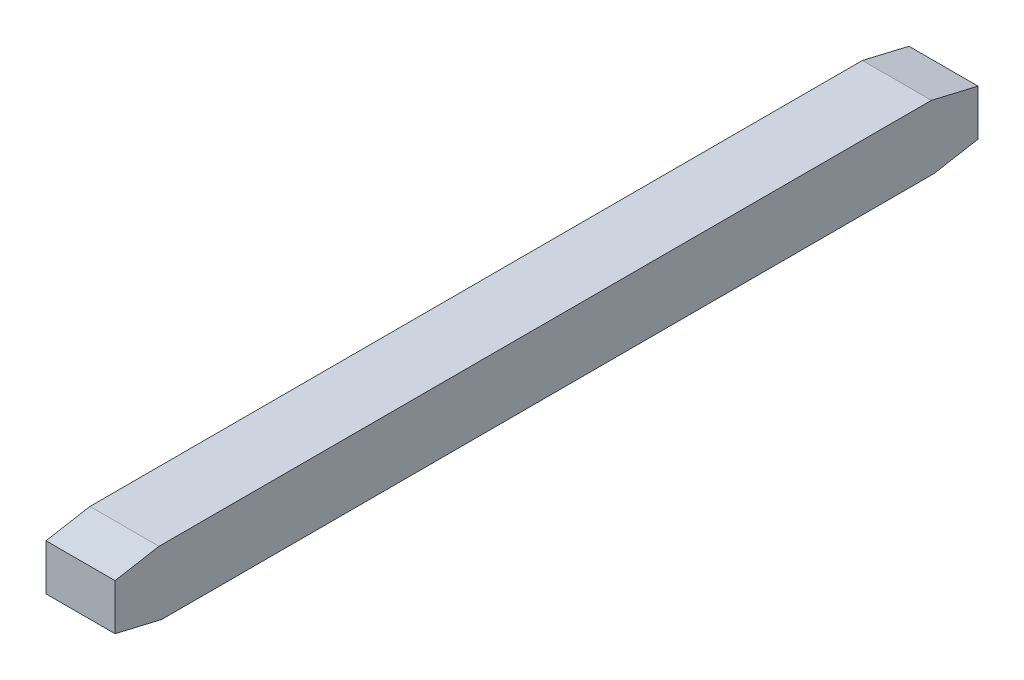
ISO-10303-21;
HEADER;
FILE_DESCRIPTION(('STEP AP214'),'2;1');
FILE_NAME('part.step','',(''),(''),'','','');
FILE_SCHEMA(('AUTOMOTIVE_DESIGN { 1 0 10303 214 1 1 1 1 }'));
ENDSEC;
DATA;
#1=APPLICATION_CONTEXT('core data for automotive mechanical design processes');
#2=APPLICATION_PROTOCOL_DEFINITION('international standard','automotive_design',2000,#1);
#3=PRODUCT_CONTEXT('',#1,'mechanical');
#4=PRODUCT('Part','Part','',(#3));
#5=PRODUCT_RELATED_PRODUCT_CATEGORY('part','',(#4));
#6=PRODUCT_DEFINITION_FORMATION('','',#4);
#7=PRODUCT_DEFINITION_CONTEXT('part definition',#1,'design');
#8=PRODUCT_DEFINITION('design','',#6,#7);
#9=PRODUCT_DEFINITION_SHAPE('','',#8);
#10=(LENGTH_UNIT() NAMED_UNIT(*) SI_UNIT(.MILLI.,.METRE.));
#11=(NAMED_UNIT(*) PLANE_ANGLE_UNIT() SI_UNIT($,.RADIAN.));
#12=(NAMED_UNIT(*) SI_UNIT($,.STERADIAN.) SOLID_ANGLE_UNIT());
#13=UNCERTAINTY_MEASURE_WITH_UNIT(LENGTH_MEASURE(1.E-05),#10,'distance_accuracy_value','');
#14=(GEOMETRIC_REPRESENTATION_CONTEXT(3) GLOBAL_UNCERTAINTY_ASSIGNED_CONTEXT((#13)) GLOBAL_UNIT_ASSIGNED_CONTEXT((#10,
#11,#12)) REPRESENTATION_CONTEXT('',''));
#15=CARTESIAN_POINT('',(0.,0.,0.));
#16=DIRECTION('',(0.,0.,1.));
#17=DIRECTION('',(1.,0.,0.));
#18=AXIS2_PLACEMENT_3D('',#15,#16,#17);
#19=CARTESIAN_POINT('',(6.037607448466,1.714899909266,-5.767942124888));
#20=DIRECTION('',(0.,0.973414507556865,-0.229050641731968));
#21=DIRECTION('',(-1.,0.,0.));
#22=AXIS2_PLACEMENT_3D('',#19,#20,#21);
#23=PLANE('',#22);
#24=DIRECTION('',(0.,0.229050641731968,0.973414507556865));
#25=VECTOR('',#24,1.);
#26=CARTESIAN_POINT('',(6.020000448466,3.155448876961,0.354072));
#27=LINE('',#26,#25);
#28=CARTESIAN_POINT('',(6.020000448466,1.613233935736,-6.2));
#29=VERTEX_POINT('',#28);
#30=CARTESIAN_POINT('',(6.020000448466,1.714899909266,-5.767942124888));
#31=VERTEX_POINT('',#30);
#32=EDGE_CURVE('E147',#29,#31,#27,.T.);
#33=ORIENTED_EDGE('',*,*,#32,.T.);
#34=DIRECTION('',(1.,0.,0.));
#35=VECTOR('',#34,1.);
#36=CARTESIAN_POINT('',(6.324893162748,1.714899909266,-5.767942124888));
#37=LINE('',#36,#35);
#38=CARTESIAN_POINT('',(6.660000162743,1.714899909266,-5.767942124888));
#39=VERTEX_POINT('',#38);
#40=EDGE_CURVE('E160',#31,#39,#37,.T.);
#41=ORIENTED_EDGE('',*,*,#40,.T.);
#42=DIRECTION('',(0.,-0.229050641731968,-0.973414507556865));
#43=VECTOR('',#42,1.);
#44=CARTESIAN_POINT('',(6.660000162743,3.155448876961,0.354072));
#45=LINE('',#44,#43);
#46=CARTESIAN_POINT('',(6.660000162743,1.613233935736,-6.2));
#47=VERTEX_POINT('',#46);
#48=EDGE_CURVE('E167',#39,#47,#45,.T.);
#49=ORIENTED_EDGE('',*,*,#48,.T.);
#50=DIRECTION('',(-1.,0.,0.));
#51=VECTOR('',#50,1.);
#52=CARTESIAN_POINT('',(6.324893162748,1.613233935736,-6.2));
#53=LINE('',#52,#51);
#54=EDGE_CURVE('E11',#47,#29,#53,.T.);
#55=ORIENTED_EDGE('',*,*,#54,.T.);
#56=EDGE_LOOP('',(#33,#41,#49,#55));
#57=FACE_BOUND('',#56,.T.);
#58=ADVANCED_FACE('F17',(#57),#23,.T.);
#59=CARTESIAN_POINT('',(6.324893162748,2.203471337813,-6.2));
#60=DIRECTION('',(0.,0.,1.));
#61=DIRECTION('',(1.,0.,0.));
#62=AXIS2_PLACEMENT_3D('',#59,#60,#61);
#63=PLANE('',#62);
#64=ORIENTED_EDGE('',*,*,#54,.F.);
#65=DIRECTION('',(0.,-1.,0.));
#66=VECTOR('',#65,1.);
#67=CARTESIAN_POINT('',(6.660000162743,-26.47327866179,-6.2));
#68=LINE('',#67,#66);
#69=CARTESIAN_POINT('',(6.660000162743,1.186765593588,-6.2));
#70=VERTEX_POINT('',#69);
#71=EDGE_CURVE('E164',#47,#70,#68,.T.);
#72=ORIENTED_EDGE('',*,*,#71,.T.);
#73=DIRECTION('',(1.,0.,0.));
#74=VECTOR('',#73,1.);
#75=CARTESIAN_POINT('',(6.324893162748,1.186765593588,-6.2));
#76=LINE('',#75,#74);
#77=CARTESIAN_POINT('',(6.020000448466,1.186765593588,-6.2));
#78=VERTEX_POINT('',#77);
#79=EDGE_CURVE('E27',#78,#70,#76,.T.);
#80=ORIENTED_EDGE('',*,*,#79,.F.);
#81=DIRECTION('',(0.,1.,0.));
#82=VECTOR('',#81,1.);
#83=CARTESIAN_POINT('',(6.020000448466,-26.47327866179,-6.2));
#84=LINE('',#83,#82);
#85=EDGE_CURVE('E150',#78,#29,#84,.T.);
#86=ORIENTED_EDGE('',*,*,#85,.T.);
#87=EDGE_LOOP('',(#64,#72,#80,#86));
#88=FACE_BOUND('',#87,.T.);
#89=ADVANCED_FACE('F211',(#88),#63,.F.);
#90=CARTESIAN_POINT('',(6.037607448466,1.186765593588,-6.2));
#91=DIRECTION('',(0.,-0.984784936297443,-0.173777528011078));
#92=DIRECTION('',(0.,0.173777528011078,-0.984784936297443));
#93=AXIS2_PLACEMENT_3D('',#90,#91,#92);
#94=PLANE('',#93);
#95=DIRECTION('',(0.,0.173777528011078,-0.984784936297443));
#96=VECTOR('',#95,1.);
#97=CARTESIAN_POINT('',(6.020000448466,0.03021822107169,0.354072));
#98=LINE('',#97,#96);
#99=CARTESIAN_POINT('',(6.020000448466,1.114899909275,-5.792742259841));
#100=VERTEX_POINT('',#99);
#101=EDGE_CURVE('E170',#100,#78,#98,.T.);
#102=ORIENTED_EDGE('',*,*,#101,.T.);
#103=ORIENTED_EDGE('',*,*,#79,.T.);
#104=DIRECTION('',(0.,-0.173777528011078,0.984784936297443));
#105=VECTOR('',#104,1.);
#106=CARTESIAN_POINT('',(6.660000162743,0.03021822107169,0.354072));
#107=LINE('',#106,#105);
#108=CARTESIAN_POINT('',(6.660000162743,1.114899909275,-5.792742259841));
#109=VERTEX_POINT('',#108);
#110=EDGE_CURVE('E158',#70,#109,#107,.T.);
#111=ORIENTED_EDGE('',*,*,#110,.T.);
#112=DIRECTION('',(-1.,0.,0.));
#113=VECTOR('',#112,1.);
#114=CARTESIAN_POINT('',(6.324893162748,1.114899909275,-5.792742259841));
#115=LINE('',#114,#113);
#116=EDGE_CURVE('E145',#109,#100,#115,.T.);
#117=ORIENTED_EDGE('',*,*,#116,.T.);
#118=EDGE_LOOP('',(#102,#103,#111,#117));
#119=FACE_BOUND('',#118,.T.);
#120=ADVANCED_FACE('F213',(#119),#94,.T.);
#121=CARTESIAN_POINT('',(6.642393162743,1.714899882707,-3.9905));
#122=DIRECTION('',(0.,-1.,0.));
#123=DIRECTION('',(0.,0.,-1.));
#124=AXIS2_PLACEMENT_3D('',#121,#122,#123);
#125=PLANE('',#124);
#126=DIRECTION('',(0.,0.,1.));
#127=VECTOR('',#126,1.);
#128=CARTESIAN_POINT('',(6.020000448466,1.714899882707,-3.9905));
#129=LINE('',#128,#127);
#130=CARTESIAN_POINT('',(6.020000448466,1.714899882707,1.392742259841));
#131=VERTEX_POINT('',#130);
#132=EDGE_CURVE('E151',#31,#131,#129,.T.);
#133=ORIENTED_EDGE('',*,*,#132,.T.);
#134=DIRECTION('',(-1.,0.,0.));
#135=VECTOR('',#134,1.);
#136=CARTESIAN_POINT('',(6.324893162748,1.714899882707,1.392742259841));
#137=LINE('',#136,#135);
#138=CARTESIAN_POINT('',(6.660000162743,1.714899882707,1.392742259841));
#139=VERTEX_POINT('',#138);
#140=EDGE_CURVE('E137',#139,#131,#137,.T.);
#141=ORIENTED_EDGE('',*,*,#140,.F.);
#142=DIRECTION('',(0.,0.,1.));
#143=VECTOR('',#142,1.);
#144=CARTESIAN_POINT('',(6.660000162743,1.714899882707,-3.9905));
#145=LINE('',#144,#143);
#146=EDGE_CURVE('E159',#39,#139,#145,.T.);
#147=ORIENTED_EDGE('',*,*,#146,.F.);
#148=ORIENTED_EDGE('',*,*,#40,.F.);
#149=EDGE_LOOP('',(#133,#141,#147,#148));
#150=FACE_BOUND('',#149,.T.);
#151=ADVANCED_FACE('F19',(#150),#125,.F.);
#152=CARTESIAN_POINT('',(6.037607448466,1.114899882716,-3.9905));
#153=DIRECTION('',(0.,1.,0.));
#154=DIRECTION('',(0.,0.,-1.));
#155=AXIS2_PLACEMENT_3D('',#152,#153,#154);
#156=PLANE('',#155);
#157=DIRECTION('',(0.,0.,1.));
#158=VECTOR('',#157,1.);
#159=CARTESIAN_POINT('',(6.660000162743,1.114899882716,-3.9905));
#160=LINE('',#159,#158);
#161=CARTESIAN_POINT('',(6.660000162743,1.114899882716,1.367942124888));
#162=VERTEX_POINT('',#161);
#163=EDGE_CURVE('E155',#109,#162,#160,.T.);
#164=ORIENTED_EDGE('',*,*,#163,.T.);
#165=DIRECTION('',(1.,0.,0.));
#166=VECTOR('',#165,1.);
#167=CARTESIAN_POINT('',(6.324893162748,1.114899882716,1.367942124888));
#168=LINE('',#167,#166);
#169=CARTESIAN_POINT('',(6.020000448466,1.114899882716,1.367942124888));
#170=VERTEX_POINT('',#169);
#171=EDGE_CURVE('E21',#170,#162,#168,.T.);
#172=ORIENTED_EDGE('',*,*,#171,.F.);
#173=DIRECTION('',(0.,0.,1.));
#174=VECTOR('',#173,1.);
#175=CARTESIAN_POINT('',(6.020000448466,1.114899882716,-3.9905));
#176=LINE('',#175,#174);
#177=EDGE_CURVE('E191',#100,#170,#176,.T.);
#178=ORIENTED_EDGE('',*,*,#177,.F.);
#179=ORIENTED_EDGE('',*,*,#116,.F.);
#180=EDGE_LOOP('',(#164,#172,#178,#179));
#181=FACE_BOUND('',#180,.T.);
#182=ADVANCED_FACE('F232',(#181),#156,.F.);
#183=CARTESIAN_POINT('',(6.020000448466,1.714899882707,-3.9905));
#184=DIRECTION('',(1.,0.,0.));
#185=DIRECTION('',(0.,1.,0.));
#186=AXIS2_PLACEMENT_3D('',#183,#184,#185);
#187=PLANE('',#186);
#188=ORIENTED_EDGE('',*,*,#177,.T.);
#189=DIRECTION('',(0.,-0.229050641731968,-0.973414507556865));
#190=VECTOR('',#189,1.);
#191=CARTESIAN_POINT('',(6.020000448466,-0.325649084979,-4.754072));
#192=LINE('',#191,#190);
#193=CARTESIAN_POINT('',(6.020000448466,1.216565856247,1.8));
#194=VERTEX_POINT('',#193);
#195=EDGE_CURVE('E98',#194,#170,#192,.T.);
#196=ORIENTED_EDGE('',*,*,#195,.F.);
#197=DIRECTION('',(0.,-1.,0.));
#198=VECTOR('',#197,1.);
#199=CARTESIAN_POINT('',(6.020000448466,29.303078453781,1.8));
#200=LINE('',#199,#198);
#201=CARTESIAN_POINT('',(6.020000448466,1.643034198394,1.8));
#202=VERTEX_POINT('',#201);
#203=EDGE_CURVE('E114',#202,#194,#200,.T.);
#204=ORIENTED_EDGE('',*,*,#203,.F.);
#205=DIRECTION('',(0.,-0.173777528011078,0.984784936297443));
#206=VECTOR('',#205,1.);
#207=CARTESIAN_POINT('',(6.020000448466,2.79958157091,-4.754072));
#208=LINE('',#207,#206);
#209=EDGE_CURVE('E119',#131,#202,#208,.T.);
#210=ORIENTED_EDGE('',*,*,#209,.F.);
#211=ORIENTED_EDGE('',*,*,#132,.F.);
#212=ORIENTED_EDGE('',*,*,#32,.F.);
#213=ORIENTED_EDGE('',*,*,#85,.F.);
#214=ORIENTED_EDGE('',*,*,#101,.F.);
#215=EDGE_LOOP('',(#188,#196,#204,#210,#211,#212,#213,#214));
#216=FACE_BOUND('',#215,.T.);
#217=ADVANCED_FACE('F116',(#216),#187,.F.);
#218=CARTESIAN_POINT('',(6.660000162743,1.110149882716,-3.9905));
#219=DIRECTION('',(-1.,0.,0.));
#220=DIRECTION('',(0.,0.,1.));
#221=AXIS2_PLACEMENT_3D('',#218,#219,#220);
#222=PLANE('',#221);
#223=ORIENTED_EDGE('',*,*,#146,.T.);
#224=DIRECTION('',(0.,0.173777528011078,-0.984784936297443));
#225=VECTOR('',#224,1.);
#226=CARTESIAN_POINT('',(6.660000162743,2.79958157091,-4.754072));
#227=LINE('',#226,#225);
#228=CARTESIAN_POINT('',(6.660000162743,1.643034198394,1.8));
#229=VERTEX_POINT('',#228);
#230=EDGE_CURVE('E132',#229,#139,#227,.T.);
#231=ORIENTED_EDGE('',*,*,#230,.F.);
#232=DIRECTION('',(0.,1.,0.));
#233=VECTOR('',#232,1.);
#234=CARTESIAN_POINT('',(6.660000162743,29.303078453781,1.8));
#235=LINE('',#234,#233);
#236=CARTESIAN_POINT('',(6.660000162743,1.216565856247,1.8));
#237=VERTEX_POINT('',#236);
#238=EDGE_CURVE('E123',#237,#229,#235,.T.);
#239=ORIENTED_EDGE('',*,*,#238,.F.);
#240=DIRECTION('',(0.,0.229050641731968,0.973414507556865));
#241=VECTOR('',#240,1.);
#242=CARTESIAN_POINT('',(6.660000162743,-0.325649084979,-4.754072));
#243=LINE('',#242,#241);
#244=EDGE_CURVE('E110',#162,#237,#243,.T.);
#245=ORIENTED_EDGE('',*,*,#244,.F.);
#246=ORIENTED_EDGE('',*,*,#163,.F.);
#247=ORIENTED_EDGE('',*,*,#110,.F.);
#248=ORIENTED_EDGE('',*,*,#71,.F.);
#249=ORIENTED_EDGE('',*,*,#48,.F.);
#250=EDGE_LOOP('',(#223,#231,#239,#245,#246,#247,#248,#249));
#251=FACE_BOUND('',#250,.T.);
#252=ADVANCED_FACE('F208',(#251),#222,.F.);
#253=CARTESIAN_POINT('',(6.037607448466,1.114899882716,1.367942124888));
#254=DIRECTION('',(0.,-0.973414507556865,0.229050641731968));
#255=DIRECTION('',(-1.,0.,0.));
#256=AXIS2_PLACEMENT_3D('',#253,#254,#255);
#257=PLANE('',#256);
#258=ORIENTED_EDGE('',*,*,#195,.T.);
#259=ORIENTED_EDGE('',*,*,#171,.T.);
#260=ORIENTED_EDGE('',*,*,#244,.T.);
#261=DIRECTION('',(-1.,0.,0.));
#262=VECTOR('',#261,1.);
#263=CARTESIAN_POINT('',(6.324893162748,1.216565856247,1.8));
#264=LINE('',#263,#262);
#265=EDGE_CURVE('E154',#237,#194,#264,.T.);
#266=ORIENTED_EDGE('',*,*,#265,.T.);
#267=EDGE_LOOP('',(#258,#259,#260,#266));
#268=FACE_BOUND('',#267,.T.);
#269=ADVANCED_FACE('F226',(#268),#257,.T.);
#270=CARTESIAN_POINT('',(6.324893162748,0.626328454169,1.8));
#271=DIRECTION('',(0.,0.,-1.));
#272=DIRECTION('',(-1.,0.,0.));
#273=AXIS2_PLACEMENT_3D('',#270,#271,#272);
#274=PLANE('',#273);
#275=ORIENTED_EDGE('',*,*,#265,.F.);
#276=ORIENTED_EDGE('',*,*,#238,.T.);
#277=DIRECTION('',(1.,0.,0.));
#278=VECTOR('',#277,1.);
#279=CARTESIAN_POINT('',(6.324893162748,1.643034198394,1.8));
#280=LINE('',#279,#278);
#281=EDGE_CURVE('E126',#202,#229,#280,.T.);
#282=ORIENTED_EDGE('',*,*,#281,.F.);
#283=ORIENTED_EDGE('',*,*,#203,.T.);
#284=EDGE_LOOP('',(#275,#276,#282,#283));
#285=FACE_BOUND('',#284,.T.);
#286=ADVANCED_FACE('F127',(#285),#274,.F.);
#287=CARTESIAN_POINT('',(6.037607448466,1.643034198394,1.8));
#288=DIRECTION('',(0.,0.984784936297443,0.173777528011078));
#289=DIRECTION('',(1.,0.,0.));
#290=AXIS2_PLACEMENT_3D('',#287,#288,#289);
#291=PLANE('',#290);
#292=ORIENTED_EDGE('',*,*,#209,.T.);
#293=ORIENTED_EDGE('',*,*,#281,.T.);
#294=ORIENTED_EDGE('',*,*,#230,.T.);
#295=ORIENTED_EDGE('',*,*,#140,.T.);
#296=EDGE_LOOP('',(#292,#293,#294,#295));
#297=FACE_BOUND('',#296,.T.);
#298=ADVANCED_FACE('F135',(#297),#291,.T.);
#299=CLOSED_SHELL('',(#58,#89,#120,#151,#182,#217,#252,#269,#286,#298));
#300=MANIFOLD_SOLID_BREP('B1',#299);
#301=ADVANCED_BREP_SHAPE_REPRESENTATION('',(#18,#300),#14);
#302=SHAPE_DEFINITION_REPRESENTATION(#9,#301);
ENDSEC;
END-ISO-10303-21;
